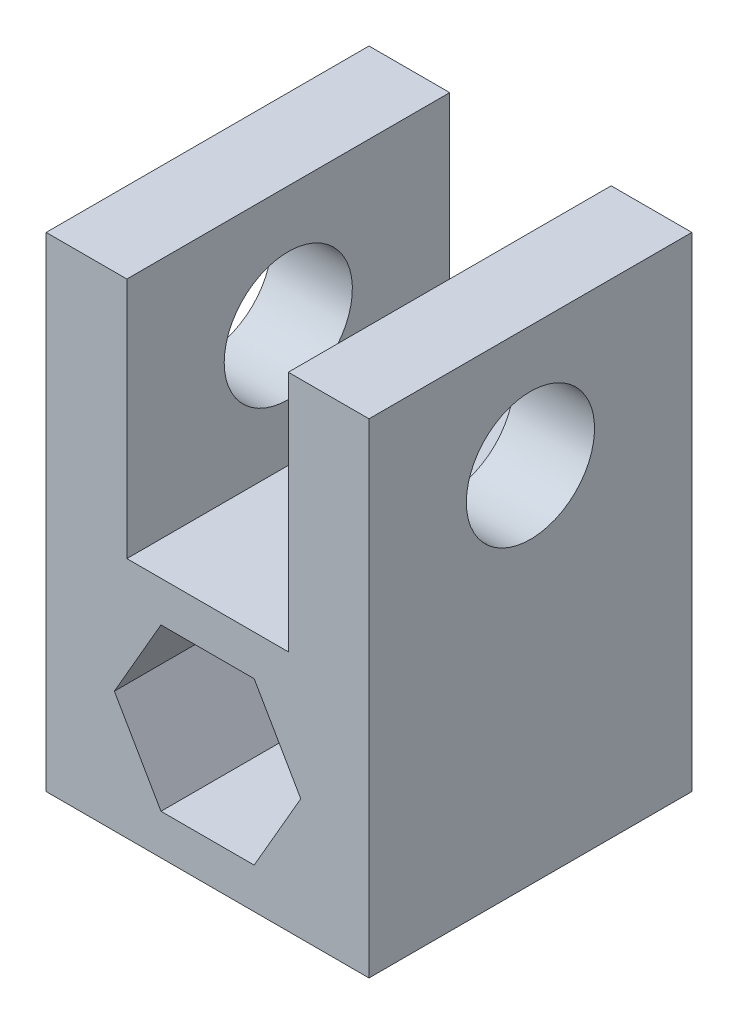
ISO-10303-21;
HEADER;
FILE_DESCRIPTION(('STEP AP214'),'2;1');
FILE_NAME('part.step','',(''),(''),'','','');
FILE_SCHEMA(('AUTOMOTIVE_DESIGN { 1 0 10303 214 1 1 1 1 }'));
ENDSEC;
DATA;
#1=APPLICATION_CONTEXT('core data for automotive mechanical design processes');
#2=APPLICATION_PROTOCOL_DEFINITION('international standard','automotive_design',2000,#1);
#3=PRODUCT_CONTEXT('',#1,'mechanical');
#4=PRODUCT('Part','Part','',(#3));
#5=PRODUCT_RELATED_PRODUCT_CATEGORY('part','',(#4));
#6=PRODUCT_DEFINITION_FORMATION('','',#4);
#7=PRODUCT_DEFINITION_CONTEXT('part definition',#1,'design');
#8=PRODUCT_DEFINITION('design','',#6,#7);
#9=PRODUCT_DEFINITION_SHAPE('','',#8);
#10=(LENGTH_UNIT() NAMED_UNIT(*) SI_UNIT(.MILLI.,.METRE.));
#11=(NAMED_UNIT(*) PLANE_ANGLE_UNIT() SI_UNIT($,.RADIAN.));
#12=(NAMED_UNIT(*) SI_UNIT($,.STERADIAN.) SOLID_ANGLE_UNIT());
#13=UNCERTAINTY_MEASURE_WITH_UNIT(LENGTH_MEASURE(1.E-05),#10,'distance_accuracy_value','');
#14=(GEOMETRIC_REPRESENTATION_CONTEXT(3) GLOBAL_UNCERTAINTY_ASSIGNED_CONTEXT((#13)) GLOBAL_UNIT_ASSIGNED_CONTEXT((#10,
#11,#12)) REPRESENTATION_CONTEXT('',''));
#15=CARTESIAN_POINT('',(0.,0.,0.));
#16=DIRECTION('',(0.,0.,1.));
#17=DIRECTION('',(1.,0.,0.));
#18=AXIS2_PLACEMENT_3D('',#15,#16,#17);
#19=CARTESIAN_POINT('',(12.7,38.1,25.4));
#20=DIRECTION('',(-1.,0.,0.));
#21=DIRECTION('',(0.,-1.,0.));
#22=AXIS2_PLACEMENT_3D('',#19,#20,#21);
#23=PLANE('',#22);
#24=CARTESIAN_POINT('',(12.7,28.575,12.7));
#25=DIRECTION('',(-1.,0.,0.));
#26=DIRECTION('',(0.,0.,1.));
#27=AXIS2_PLACEMENT_3D('',#24,#25,#26);
#28=CIRCLE('',#27,5.04189999999999);
#29=CARTESIAN_POINT('',(12.7,28.575,17.7419));
#30=VERTEX_POINT('',#29);
#31=EDGE_CURVE('E309',#30,#30,#28,.T.);
#32=ORIENTED_EDGE('',*,*,#31,.T.);
#33=EDGE_LOOP('',(#32));
#34=FACE_BOUND('',#33,.T.);
#35=DIRECTION('',(0.,1.,0.));
#36=VECTOR('',#35,1.);
#37=CARTESIAN_POINT('',(12.7,38.1,0.));
#38=LINE('',#37,#36);
#39=CARTESIAN_POINT('',(12.7,0.,0.));
#40=VERTEX_POINT('',#39);
#41=CARTESIAN_POINT('',(12.7,38.1,0.));
#42=VERTEX_POINT('',#41);
#43=EDGE_CURVE('E189',#40,#42,#38,.T.);
#44=ORIENTED_EDGE('',*,*,#43,.T.);
#45=DIRECTION('',(0.,0.,-1.));
#46=VECTOR('',#45,1.);
#47=CARTESIAN_POINT('',(12.7,38.1,25.4));
#48=LINE('',#47,#46);
#49=CARTESIAN_POINT('',(12.7,38.1,25.4));
#50=VERTEX_POINT('',#49);
#51=EDGE_CURVE('E11',#50,#42,#48,.T.);
#52=ORIENTED_EDGE('',*,*,#51,.F.);
#53=DIRECTION('',(0.,1.,0.));
#54=VECTOR('',#53,1.);
#55=CARTESIAN_POINT('',(12.7,38.1,25.4));
#56=LINE('',#55,#54);
#57=CARTESIAN_POINT('',(12.7,0.,25.4));
#58=VERTEX_POINT('',#57);
#59=EDGE_CURVE('E197',#58,#50,#56,.T.);
#60=ORIENTED_EDGE('',*,*,#59,.F.);
#61=DIRECTION('',(0.,0.,-1.));
#62=VECTOR('',#61,1.);
#63=CARTESIAN_POINT('',(12.7,0.,25.4));
#64=LINE('',#63,#62);
#65=EDGE_CURVE('E215',#58,#40,#64,.T.);
#66=ORIENTED_EDGE('',*,*,#65,.T.);
#67=EDGE_LOOP('',(#44,#52,#60,#66));
#68=FACE_BOUND('',#67,.T.);
#69=ADVANCED_FACE('F40',(#34,#68),#23,.F.);
#70=CARTESIAN_POINT('',(6.34999999999999,38.1,25.4));
#71=DIRECTION('',(0.,-1.,0.));
#72=DIRECTION('',(0.,0.,-1.));
#73=AXIS2_PLACEMENT_3D('',#70,#71,#72);
#74=PLANE('',#73);
#75=DIRECTION('',(-1.,0.,0.));
#76=VECTOR('',#75,1.);
#77=CARTESIAN_POINT('',(6.34999999999999,38.1,0.));
#78=LINE('',#77,#76);
#79=CARTESIAN_POINT('',(6.34999999999999,38.1,0.));
#80=VERTEX_POINT('',#79);
#81=EDGE_CURVE('E218',#42,#80,#78,.T.);
#82=ORIENTED_EDGE('',*,*,#81,.T.);
#83=DIRECTION('',(0.,0.,-1.));
#84=VECTOR('',#83,1.);
#85=CARTESIAN_POINT('',(6.34999999999999,38.1,25.4));
#86=LINE('',#85,#84);
#87=CARTESIAN_POINT('',(6.34999999999999,38.1,25.4));
#88=VERTEX_POINT('',#87);
#89=EDGE_CURVE('E48',#88,#80,#86,.T.);
#90=ORIENTED_EDGE('',*,*,#89,.F.);
#91=DIRECTION('',(-1.,0.,0.));
#92=VECTOR('',#91,1.);
#93=CARTESIAN_POINT('',(6.34999999999999,38.1,25.4));
#94=LINE('',#93,#92);
#95=EDGE_CURVE('E200',#50,#88,#94,.T.);
#96=ORIENTED_EDGE('',*,*,#95,.F.);
#97=ORIENTED_EDGE('',*,*,#51,.T.);
#98=EDGE_LOOP('',(#82,#90,#96,#97));
#99=FACE_BOUND('',#98,.T.);
#100=ADVANCED_FACE('F274',(#99),#74,.F.);
#101=CARTESIAN_POINT('',(6.34999999999999,19.05,25.4));
#102=DIRECTION('',(1.,0.,0.));
#103=DIRECTION('',(0.,1.,0.));
#104=AXIS2_PLACEMENT_3D('',#101,#102,#103);
#105=PLANE('',#104);
#106=CARTESIAN_POINT('',(6.34999999999999,28.575,12.7));
#107=DIRECTION('',(1.,0.,0.));
#108=DIRECTION('',(0.,1.,0.));
#109=AXIS2_PLACEMENT_3D('',#106,#107,#108);
#110=CIRCLE('',#109,5.0419);
#111=CARTESIAN_POINT('',(6.34999999999999,33.6169,12.7));
#112=VERTEX_POINT('',#111);
#113=EDGE_CURVE('E166',#112,#112,#110,.T.);
#114=ORIENTED_EDGE('',*,*,#113,.T.);
#115=EDGE_LOOP('',(#114));
#116=FACE_BOUND('',#115,.T.);
#117=DIRECTION('',(0.,-1.,0.));
#118=VECTOR('',#117,1.);
#119=CARTESIAN_POINT('',(6.34999999999999,19.05,0.));
#120=LINE('',#119,#118);
#121=CARTESIAN_POINT('',(6.34999999999999,19.05,0.));
#122=VERTEX_POINT('',#121);
#123=EDGE_CURVE('E220',#80,#122,#120,.T.);
#124=ORIENTED_EDGE('',*,*,#123,.T.);
#125=DIRECTION('',(0.,0.,-1.));
#126=VECTOR('',#125,1.);
#127=CARTESIAN_POINT('',(6.34999999999999,19.05,25.4));
#128=LINE('',#127,#126);
#129=CARTESIAN_POINT('',(6.34999999999999,19.05,25.4));
#130=VERTEX_POINT('',#129);
#131=EDGE_CURVE('E245',#130,#122,#128,.T.);
#132=ORIENTED_EDGE('',*,*,#131,.F.);
#133=DIRECTION('',(0.,-1.,0.));
#134=VECTOR('',#133,1.);
#135=CARTESIAN_POINT('',(6.34999999999999,19.05,25.4));
#136=LINE('',#135,#134);
#137=EDGE_CURVE('E203',#88,#130,#136,.T.);
#138=ORIENTED_EDGE('',*,*,#137,.F.);
#139=ORIENTED_EDGE('',*,*,#89,.T.);
#140=EDGE_LOOP('',(#124,#132,#138,#139));
#141=FACE_BOUND('',#140,.T.);
#142=ADVANCED_FACE('F253',(#116,#141),#105,.F.);
#143=CARTESIAN_POINT('',(-6.34999999999999,19.05,25.4));
#144=DIRECTION('',(0.,-1.,0.));
#145=DIRECTION('',(1.,0.,0.));
#146=AXIS2_PLACEMENT_3D('',#143,#144,#145);
#147=PLANE('',#146);
#148=DIRECTION('',(-1.,0.,0.));
#149=VECTOR('',#148,1.);
#150=CARTESIAN_POINT('',(-6.34999999999999,19.05,0.));
#151=LINE('',#150,#149);
#152=CARTESIAN_POINT('',(-6.34999999999999,19.05,0.));
#153=VERTEX_POINT('',#152);
#154=EDGE_CURVE('E222',#122,#153,#151,.T.);
#155=ORIENTED_EDGE('',*,*,#154,.T.);
#156=DIRECTION('',(0.,0.,-1.));
#157=VECTOR('',#156,1.);
#158=CARTESIAN_POINT('',(-6.34999999999999,19.05,25.4));
#159=LINE('',#158,#157);
#160=CARTESIAN_POINT('',(-6.34999999999999,19.05,25.4));
#161=VERTEX_POINT('',#160);
#162=EDGE_CURVE('E242',#161,#153,#159,.T.);
#163=ORIENTED_EDGE('',*,*,#162,.F.);
#164=DIRECTION('',(-1.,0.,0.));
#165=VECTOR('',#164,1.);
#166=CARTESIAN_POINT('',(-6.34999999999999,19.05,25.4));
#167=LINE('',#166,#165);
#168=EDGE_CURVE('E205',#130,#161,#167,.T.);
#169=ORIENTED_EDGE('',*,*,#168,.F.);
#170=ORIENTED_EDGE('',*,*,#131,.T.);
#171=EDGE_LOOP('',(#155,#163,#169,#170));
#172=FACE_BOUND('',#171,.T.);
#173=ADVANCED_FACE('F262',(#172),#147,.F.);
#174=CARTESIAN_POINT('',(-6.35,38.1,25.4));
#175=DIRECTION('',(-1.,0.,0.));
#176=DIRECTION('',(0.,-1.,0.));
#177=AXIS2_PLACEMENT_3D('',#174,#175,#176);
#178=PLANE('',#177);
#179=CARTESIAN_POINT('',(-6.35,28.575,12.7));
#180=DIRECTION('',(-1.,0.,0.));
#181=DIRECTION('',(0.,-1.,0.));
#182=AXIS2_PLACEMENT_3D('',#179,#180,#181);
#183=CIRCLE('',#182,5.0419);
#184=CARTESIAN_POINT('',(-6.35,23.5331,12.7));
#185=VERTEX_POINT('',#184);
#186=EDGE_CURVE('E43',#185,#185,#183,.T.);
#187=ORIENTED_EDGE('',*,*,#186,.T.);
#188=EDGE_LOOP('',(#187));
#189=FACE_BOUND('',#188,.T.);
#190=DIRECTION('',(0.,1.,0.));
#191=VECTOR('',#190,1.);
#192=CARTESIAN_POINT('',(-6.35,38.1,0.));
#193=LINE('',#192,#191);
#194=CARTESIAN_POINT('',(-6.35,38.1,0.));
#195=VERTEX_POINT('',#194);
#196=EDGE_CURVE('E224',#153,#195,#193,.T.);
#197=ORIENTED_EDGE('',*,*,#196,.T.);
#198=DIRECTION('',(0.,0.,-1.));
#199=VECTOR('',#198,1.);
#200=CARTESIAN_POINT('',(-6.35,38.1,25.4));
#201=LINE('',#200,#199);
#202=CARTESIAN_POINT('',(-6.35,38.1,25.4));
#203=VERTEX_POINT('',#202);
#204=EDGE_CURVE('E239',#203,#195,#201,.T.);
#205=ORIENTED_EDGE('',*,*,#204,.F.);
#206=DIRECTION('',(0.,1.,0.));
#207=VECTOR('',#206,1.);
#208=CARTESIAN_POINT('',(-6.35,38.1,25.4));
#209=LINE('',#208,#207);
#210=EDGE_CURVE('E207',#161,#203,#209,.T.);
#211=ORIENTED_EDGE('',*,*,#210,.F.);
#212=ORIENTED_EDGE('',*,*,#162,.T.);
#213=EDGE_LOOP('',(#197,#205,#211,#212));
#214=FACE_BOUND('',#213,.T.);
#215=ADVANCED_FACE('F266',(#189,#214),#178,.F.);
#216=CARTESIAN_POINT('',(-12.7,38.1,25.4));
#217=DIRECTION('',(0.,-1.,0.));
#218=DIRECTION('',(0.,0.,-1.));
#219=AXIS2_PLACEMENT_3D('',#216,#217,#218);
#220=PLANE('',#219);
#221=DIRECTION('',(-1.,0.,0.));
#222=VECTOR('',#221,1.);
#223=CARTESIAN_POINT('',(-12.7,38.1,0.));
#224=LINE('',#223,#222);
#225=CARTESIAN_POINT('',(-12.7,38.1,0.));
#226=VERTEX_POINT('',#225);
#227=EDGE_CURVE('E226',#195,#226,#224,.T.);
#228=ORIENTED_EDGE('',*,*,#227,.T.);
#229=DIRECTION('',(0.,0.,-1.));
#230=VECTOR('',#229,1.);
#231=CARTESIAN_POINT('',(-12.7,38.1,25.4));
#232=LINE('',#231,#230);
#233=CARTESIAN_POINT('',(-12.7,38.1,25.4));
#234=VERTEX_POINT('',#233);
#235=EDGE_CURVE('E236',#234,#226,#232,.T.);
#236=ORIENTED_EDGE('',*,*,#235,.F.);
#237=DIRECTION('',(-1.,0.,0.));
#238=VECTOR('',#237,1.);
#239=CARTESIAN_POINT('',(-12.7,38.1,25.4));
#240=LINE('',#239,#238);
#241=EDGE_CURVE('E209',#203,#234,#240,.T.);
#242=ORIENTED_EDGE('',*,*,#241,.F.);
#243=ORIENTED_EDGE('',*,*,#204,.T.);
#244=EDGE_LOOP('',(#228,#236,#242,#243));
#245=FACE_BOUND('',#244,.T.);
#246=ADVANCED_FACE('F287',(#245),#220,.F.);
#247=CARTESIAN_POINT('',(-12.7,0.,25.4));
#248=DIRECTION('',(1.,0.,0.));
#249=DIRECTION('',(0.,0.,-1.));
#250=AXIS2_PLACEMENT_3D('',#247,#248,#249);
#251=PLANE('',#250);
#252=CARTESIAN_POINT('',(-12.7,28.575,12.7));
#253=DIRECTION('',(-1.,0.,0.));
#254=DIRECTION('',(0.,0.,1.));
#255=AXIS2_PLACEMENT_3D('',#252,#253,#254);
#256=CIRCLE('',#255,5.0419);
#257=CARTESIAN_POINT('',(-12.7,28.575,17.7419));
#258=VERTEX_POINT('',#257);
#259=EDGE_CURVE('E311',#258,#258,#256,.T.);
#260=ORIENTED_EDGE('',*,*,#259,.F.);
#261=EDGE_LOOP('',(#260));
#262=FACE_BOUND('',#261,.T.);
#263=DIRECTION('',(0.,-1.,0.));
#264=VECTOR('',#263,1.);
#265=CARTESIAN_POINT('',(-12.7,0.,0.));
#266=LINE('',#265,#264);
#267=CARTESIAN_POINT('',(-12.7,0.,0.));
#268=VERTEX_POINT('',#267);
#269=EDGE_CURVE('E228',#226,#268,#266,.T.);
#270=ORIENTED_EDGE('',*,*,#269,.T.);
#271=DIRECTION('',(0.,0.,-1.));
#272=VECTOR('',#271,1.);
#273=CARTESIAN_POINT('',(-12.7,0.,25.4));
#274=LINE('',#273,#272);
#275=CARTESIAN_POINT('',(-12.7,0.,25.4));
#276=VERTEX_POINT('',#275);
#277=EDGE_CURVE('E233',#276,#268,#274,.T.);
#278=ORIENTED_EDGE('',*,*,#277,.F.);
#279=DIRECTION('',(0.,-1.,0.));
#280=VECTOR('',#279,1.);
#281=CARTESIAN_POINT('',(-12.7,0.,25.4));
#282=LINE('',#281,#280);
#283=EDGE_CURVE('E211',#234,#276,#282,.T.);
#284=ORIENTED_EDGE('',*,*,#283,.F.);
#285=ORIENTED_EDGE('',*,*,#235,.T.);
#286=EDGE_LOOP('',(#270,#278,#284,#285));
#287=FACE_BOUND('',#286,.T.);
#288=ADVANCED_FACE('F285',(#262,#287),#251,.F.);
#289=CARTESIAN_POINT('',(-12.7,0.,25.4));
#290=DIRECTION('',(0.,1.,0.));
#291=DIRECTION('',(0.,0.,1.));
#292=AXIS2_PLACEMENT_3D('',#289,#290,#291);
#293=PLANE('',#292);
#294=DIRECTION('',(1.,0.,0.));
#295=VECTOR('',#294,1.);
#296=CARTESIAN_POINT('',(-12.7,0.,0.));
#297=LINE('',#296,#295);
#298=EDGE_CURVE('E201',#268,#40,#297,.T.);
#299=ORIENTED_EDGE('',*,*,#298,.T.);
#300=ORIENTED_EDGE('',*,*,#65,.F.);
#301=DIRECTION('',(1.,0.,0.));
#302=VECTOR('',#301,1.);
#303=CARTESIAN_POINT('',(-12.7,0.,25.4));
#304=LINE('',#303,#302);
#305=EDGE_CURVE('E213',#276,#58,#304,.T.);
#306=ORIENTED_EDGE('',*,*,#305,.F.);
#307=ORIENTED_EDGE('',*,*,#277,.T.);
#308=EDGE_LOOP('',(#299,#300,#306,#307));
#309=FACE_BOUND('',#308,.T.);
#310=ADVANCED_FACE('F280',(#309),#293,.F.);
#311=CARTESIAN_POINT('',(0.,0.,25.4));
#312=DIRECTION('',(0.,0.,1.));
#313=DIRECTION('',(1.,0.,0.));
#314=AXIS2_PLACEMENT_3D('',#311,#312,#313);
#315=PLANE('',#314);
#316=DIRECTION('',(-0.499999999999999,0.866025403784439,0.));
#317=VECTOR('',#316,1.);
#318=CARTESIAN_POINT('',(7.33234841870825,9.525,25.4));
#319=LINE('',#318,#317);
#320=CARTESIAN_POINT('',(7.33234841870825,9.525,25.4));
#321=VERTEX_POINT('',#320);
#322=CARTESIAN_POINT('',(3.66617420935413,15.875,25.4));
#323=VERTEX_POINT('',#322);
#324=EDGE_CURVE('E55',#321,#323,#319,.T.);
#325=ORIENTED_EDGE('',*,*,#324,.F.);
#326=DIRECTION('',(0.5,0.866025403784439,0.));
#327=VECTOR('',#326,1.);
#328=CARTESIAN_POINT('',(3.66617420935412,3.175,25.4));
#329=LINE('',#328,#327);
#330=CARTESIAN_POINT('',(3.66617420935412,3.175,25.4));
#331=VERTEX_POINT('',#330);
#332=EDGE_CURVE('E160',#331,#321,#329,.T.);
#333=ORIENTED_EDGE('',*,*,#332,.F.);
#334=DIRECTION('',(1.,0.,0.));
#335=VECTOR('',#334,1.);
#336=CARTESIAN_POINT('',(-3.66617420935412,3.175,25.4));
#337=LINE('',#336,#335);
#338=CARTESIAN_POINT('',(-3.66617420935412,3.175,25.4));
#339=VERTEX_POINT('',#338);
#340=EDGE_CURVE('E163',#339,#331,#337,.T.);
#341=ORIENTED_EDGE('',*,*,#340,.F.);
#342=DIRECTION('',(0.5,-0.866025403784439,0.));
#343=VECTOR('',#342,1.);
#344=CARTESIAN_POINT('',(-7.33234841870825,9.525,25.4));
#345=LINE('',#344,#343);
#346=CARTESIAN_POINT('',(-7.33234841870825,9.525,25.4));
#347=VERTEX_POINT('',#346);
#348=EDGE_CURVE('E182',#347,#339,#345,.T.);
#349=ORIENTED_EDGE('',*,*,#348,.F.);
#350=DIRECTION('',(-0.5,-0.866025403784439,0.));
#351=VECTOR('',#350,1.);
#352=CARTESIAN_POINT('',(-3.66617420935413,15.875,25.4));
#353=LINE('',#352,#351);
#354=CARTESIAN_POINT('',(-3.66617420935413,15.875,25.4));
#355=VERTEX_POINT('',#354);
#356=EDGE_CURVE('E179',#355,#347,#353,.T.);
#357=ORIENTED_EDGE('',*,*,#356,.F.);
#358=DIRECTION('',(-1.,0.,0.));
#359=VECTOR('',#358,1.);
#360=CARTESIAN_POINT('',(3.66617420935413,15.875,25.4));
#361=LINE('',#360,#359);
#362=EDGE_CURVE('E177',#323,#355,#361,.T.);
#363=ORIENTED_EDGE('',*,*,#362,.F.);
#364=EDGE_LOOP('',(#325,#333,#341,#349,#357,#363));
#365=FACE_BOUND('',#364,.T.);
#366=ORIENTED_EDGE('',*,*,#59,.T.);
#367=ORIENTED_EDGE('',*,*,#95,.T.);
#368=ORIENTED_EDGE('',*,*,#137,.T.);
#369=ORIENTED_EDGE('',*,*,#168,.T.);
#370=ORIENTED_EDGE('',*,*,#210,.T.);
#371=ORIENTED_EDGE('',*,*,#241,.T.);
#372=ORIENTED_EDGE('',*,*,#283,.T.);
#373=ORIENTED_EDGE('',*,*,#305,.T.);
#374=EDGE_LOOP('',(#366,#367,#368,#369,#370,#371,#372,#373));
#375=FACE_BOUND('',#374,.T.);
#376=ADVANCED_FACE('F270',(#365,#375),#315,.T.);
#377=CARTESIAN_POINT('',(0.,0.,0.));
#378=DIRECTION('',(0.,0.,1.));
#379=DIRECTION('',(1.,0.,0.));
#380=AXIS2_PLACEMENT_3D('',#377,#378,#379);
#381=PLANE('',#380);
#382=DIRECTION('',(0.5,0.866025403784439,0.));
#383=VECTOR('',#382,1.);
#384=CARTESIAN_POINT('',(3.66617420935412,3.175,0.));
#385=LINE('',#384,#383);
#386=CARTESIAN_POINT('',(3.66617420935412,3.175,0.));
#387=VERTEX_POINT('',#386);
#388=CARTESIAN_POINT('',(7.33234841870825,9.525,0.));
#389=VERTEX_POINT('',#388);
#390=EDGE_CURVE('E149',#387,#389,#385,.T.);
#391=ORIENTED_EDGE('',*,*,#390,.T.);
#392=DIRECTION('',(-0.499999999999999,0.866025403784439,0.));
#393=VECTOR('',#392,1.);
#394=CARTESIAN_POINT('',(7.33234841870825,9.525,0.));
#395=LINE('',#394,#393);
#396=CARTESIAN_POINT('',(3.66617420935413,15.875,0.));
#397=VERTEX_POINT('',#396);
#398=EDGE_CURVE('E143',#389,#397,#395,.T.);
#399=ORIENTED_EDGE('',*,*,#398,.T.);
#400=DIRECTION('',(-1.,0.,0.));
#401=VECTOR('',#400,1.);
#402=CARTESIAN_POINT('',(3.66617420935413,15.875,0.));
#403=LINE('',#402,#401);
#404=CARTESIAN_POINT('',(-3.66617420935413,15.875,0.));
#405=VERTEX_POINT('',#404);
#406=EDGE_CURVE('E152',#397,#405,#403,.T.);
#407=ORIENTED_EDGE('',*,*,#406,.T.);
#408=DIRECTION('',(-0.5,-0.866025403784439,0.));
#409=VECTOR('',#408,1.);
#410=CARTESIAN_POINT('',(-3.66617420935413,15.875,0.));
#411=LINE('',#410,#409);
#412=CARTESIAN_POINT('',(-7.33234841870825,9.525,0.));
#413=VERTEX_POINT('',#412);
#414=EDGE_CURVE('E63',#405,#413,#411,.T.);
#415=ORIENTED_EDGE('',*,*,#414,.T.);
#416=DIRECTION('',(0.5,-0.866025403784439,0.));
#417=VECTOR('',#416,1.);
#418=CARTESIAN_POINT('',(-7.33234841870825,9.525,0.));
#419=LINE('',#418,#417);
#420=CARTESIAN_POINT('',(-3.66617420935412,3.175,0.));
#421=VERTEX_POINT('',#420);
#422=EDGE_CURVE('E170',#413,#421,#419,.T.);
#423=ORIENTED_EDGE('',*,*,#422,.T.);
#424=DIRECTION('',(1.,0.,0.));
#425=VECTOR('',#424,1.);
#426=CARTESIAN_POINT('',(-3.66617420935412,3.175,0.));
#427=LINE('',#426,#425);
#428=EDGE_CURVE('E173',#421,#387,#427,.T.);
#429=ORIENTED_EDGE('',*,*,#428,.T.);
#430=EDGE_LOOP('',(#391,#399,#407,#415,#423,#429));
#431=FACE_BOUND('',#430,.T.);
#432=ORIENTED_EDGE('',*,*,#43,.F.);
#433=ORIENTED_EDGE('',*,*,#298,.F.);
#434=ORIENTED_EDGE('',*,*,#269,.F.);
#435=ORIENTED_EDGE('',*,*,#227,.F.);
#436=ORIENTED_EDGE('',*,*,#196,.F.);
#437=ORIENTED_EDGE('',*,*,#154,.F.);
#438=ORIENTED_EDGE('',*,*,#123,.F.);
#439=ORIENTED_EDGE('',*,*,#81,.F.);
#440=EDGE_LOOP('',(#432,#433,#434,#435,#436,#437,#438,#439));
#441=FACE_BOUND('',#440,.T.);
#442=ADVANCED_FACE('F156',(#431,#441),#381,.F.);
#443=CARTESIAN_POINT('',(7.33234841870825,9.525,0.));
#444=DIRECTION('',(0.866025403784439,0.499999999999999,0.));
#445=DIRECTION('',(-0.499999999999999,0.866025403784439,0.));
#446=AXIS2_PLACEMENT_3D('',#443,#444,#445);
#447=PLANE('',#446);
#448=ORIENTED_EDGE('',*,*,#324,.T.);
#449=DIRECTION('',(0.,0.,1.));
#450=VECTOR('',#449,1.);
#451=CARTESIAN_POINT('',(3.66617420935413,15.875,0.));
#452=LINE('',#451,#450);
#453=EDGE_CURVE('E139',#397,#323,#452,.T.);
#454=ORIENTED_EDGE('',*,*,#453,.F.);
#455=ORIENTED_EDGE('',*,*,#398,.F.);
#456=DIRECTION('',(0.,0.,1.));
#457=VECTOR('',#456,1.);
#458=CARTESIAN_POINT('',(7.33234841870825,9.525,0.));
#459=LINE('',#458,#457);
#460=EDGE_CURVE('E187',#389,#321,#459,.T.);
#461=ORIENTED_EDGE('',*,*,#460,.T.);
#462=EDGE_LOOP('',(#448,#454,#455,#461));
#463=FACE_BOUND('',#462,.T.);
#464=ADVANCED_FACE('F141',(#463),#447,.F.);
#465=CARTESIAN_POINT('',(3.66617420935412,3.175,0.));
#466=DIRECTION('',(0.866025403784439,-0.5,0.));
#467=DIRECTION('',(0.5,0.866025403784439,0.));
#468=AXIS2_PLACEMENT_3D('',#465,#466,#467);
#469=PLANE('',#468);
#470=ORIENTED_EDGE('',*,*,#332,.T.);
#471=ORIENTED_EDGE('',*,*,#460,.F.);
#472=ORIENTED_EDGE('',*,*,#390,.F.);
#473=DIRECTION('',(0.,0.,1.));
#474=VECTOR('',#473,1.);
#475=CARTESIAN_POINT('',(3.66617420935412,3.175,0.));
#476=LINE('',#475,#474);
#477=EDGE_CURVE('E190',#387,#331,#476,.T.);
#478=ORIENTED_EDGE('',*,*,#477,.T.);
#479=EDGE_LOOP('',(#470,#471,#472,#478));
#480=FACE_BOUND('',#479,.T.);
#481=ADVANCED_FACE('F329',(#480),#469,.F.);
#482=CARTESIAN_POINT('',(-3.66617420935412,3.175,0.));
#483=DIRECTION('',(0.,-1.,0.));
#484=DIRECTION('',(0.,0.,-1.));
#485=AXIS2_PLACEMENT_3D('',#482,#483,#484);
#486=PLANE('',#485);
#487=ORIENTED_EDGE('',*,*,#340,.T.);
#488=ORIENTED_EDGE('',*,*,#477,.F.);
#489=ORIENTED_EDGE('',*,*,#428,.F.);
#490=DIRECTION('',(0.,0.,1.));
#491=VECTOR('',#490,1.);
#492=CARTESIAN_POINT('',(-3.66617420935412,3.175,0.));
#493=LINE('',#492,#491);
#494=EDGE_CURVE('E192',#421,#339,#493,.T.);
#495=ORIENTED_EDGE('',*,*,#494,.T.);
#496=EDGE_LOOP('',(#487,#488,#489,#495));
#497=FACE_BOUND('',#496,.T.);
#498=ADVANCED_FACE('F332',(#497),#486,.F.);
#499=CARTESIAN_POINT('',(-7.33234841870825,9.525,0.));
#500=DIRECTION('',(-0.866025403784439,-0.5,0.));
#501=DIRECTION('',(0.5,-0.866025403784439,0.));
#502=AXIS2_PLACEMENT_3D('',#499,#500,#501);
#503=PLANE('',#502);
#504=ORIENTED_EDGE('',*,*,#348,.T.);
#505=ORIENTED_EDGE('',*,*,#494,.F.);
#506=ORIENTED_EDGE('',*,*,#422,.F.);
#507=DIRECTION('',(0.,0.,1.));
#508=VECTOR('',#507,1.);
#509=CARTESIAN_POINT('',(-7.33234841870825,9.525,0.));
#510=LINE('',#509,#508);
#511=EDGE_CURVE('E194',#413,#347,#510,.T.);
#512=ORIENTED_EDGE('',*,*,#511,.T.);
#513=EDGE_LOOP('',(#504,#505,#506,#512));
#514=FACE_BOUND('',#513,.T.);
#515=ADVANCED_FACE('F336',(#514),#503,.F.);
#516=CARTESIAN_POINT('',(-3.66617420935413,15.875,0.));
#517=DIRECTION('',(-0.866025403784439,0.5,0.));
#518=DIRECTION('',(-0.5,-0.866025403784439,0.));
#519=AXIS2_PLACEMENT_3D('',#516,#517,#518);
#520=PLANE('',#519);
#521=ORIENTED_EDGE('',*,*,#356,.T.);
#522=ORIENTED_EDGE('',*,*,#511,.F.);
#523=ORIENTED_EDGE('',*,*,#414,.F.);
#524=DIRECTION('',(0.,0.,1.));
#525=VECTOR('',#524,1.);
#526=CARTESIAN_POINT('',(-3.66617420935413,15.875,0.));
#527=LINE('',#526,#525);
#528=EDGE_CURVE('E148',#405,#355,#527,.T.);
#529=ORIENTED_EDGE('',*,*,#528,.T.);
#530=EDGE_LOOP('',(#521,#522,#523,#529));
#531=FACE_BOUND('',#530,.T.);
#532=ADVANCED_FACE('F326',(#531),#520,.F.);
#533=CARTESIAN_POINT('',(3.66617420935413,15.875,0.));
#534=DIRECTION('',(0.,1.,0.));
#535=DIRECTION('',(0.,0.,1.));
#536=AXIS2_PLACEMENT_3D('',#533,#534,#535);
#537=PLANE('',#536);
#538=ORIENTED_EDGE('',*,*,#362,.T.);
#539=ORIENTED_EDGE('',*,*,#528,.F.);
#540=ORIENTED_EDGE('',*,*,#406,.F.);
#541=ORIENTED_EDGE('',*,*,#453,.T.);
#542=EDGE_LOOP('',(#538,#539,#540,#541));
#543=FACE_BOUND('',#542,.T.);
#544=ADVANCED_FACE('F153',(#543),#537,.F.);
#545=CARTESIAN_POINT('',(-12.7,28.575,12.7));
#546=DIRECTION('',(-1.,0.,0.));
#547=DIRECTION('',(0.,0.,1.));
#548=AXIS2_PLACEMENT_3D('',#545,#546,#547);
#549=CYLINDRICAL_SURFACE('',#548,5.0419);
#550=ORIENTED_EDGE('',*,*,#259,.T.);
#551=EDGE_LOOP('',(#550));
#552=FACE_BOUND('',#551,.T.);
#553=ORIENTED_EDGE('',*,*,#186,.F.);
#554=EDGE_LOOP('',(#553));
#555=FACE_BOUND('',#554,.T.);
#556=ADVANCED_FACE('F317',(#552,#555),#549,.F.);
#557=ORIENTED_EDGE('',*,*,#31,.F.);
#558=EDGE_LOOP('',(#557));
#559=FACE_BOUND('',#558,.T.);
#560=ORIENTED_EDGE('',*,*,#113,.F.);
#561=EDGE_LOOP('',(#560));
#562=FACE_BOUND('',#561,.T.);
#563=ADVANCED_FACE('F320',(#559,#562),#549,.F.);
#564=CLOSED_SHELL('',(#69,#100,#142,#173,#215,#246,#288,#310,#376,#442,#464,#481,#498,#515,#532,
#544,#556,#563));
#565=MANIFOLD_SOLID_BREP('B2',#564);
#566=ADVANCED_BREP_SHAPE_REPRESENTATION('',(#18,#565),#14);
#567=SHAPE_DEFINITION_REPRESENTATION(#9,#566);
ENDSEC;
END-ISO-10303-21;
